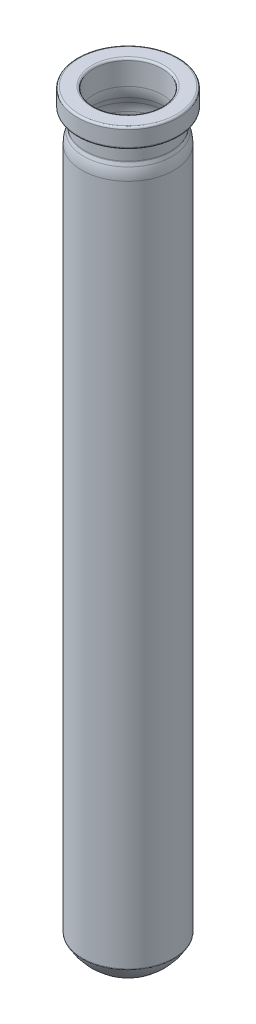
ISO-10303-21;
HEADER;
FILE_DESCRIPTION(('STEP AP214'),'2;1');
FILE_NAME('part.step','',(''),(''),'','','');
FILE_SCHEMA(('AUTOMOTIVE_DESIGN { 1 0 10303 214 1 1 1 1 }'));
ENDSEC;
DATA;
#1=APPLICATION_CONTEXT('core data for automotive mechanical design processes');
#2=APPLICATION_PROTOCOL_DEFINITION('international standard','automotive_design',2000,#1);
#3=PRODUCT_CONTEXT('',#1,'mechanical');
#4=PRODUCT('Part','Part','',(#3));
#5=PRODUCT_RELATED_PRODUCT_CATEGORY('part','',(#4));
#6=PRODUCT_DEFINITION_FORMATION('','',#4);
#7=PRODUCT_DEFINITION_CONTEXT('part definition',#1,'design');
#8=PRODUCT_DEFINITION('design','',#6,#7);
#9=PRODUCT_DEFINITION_SHAPE('','',#8);
#10=(LENGTH_UNIT() NAMED_UNIT(*) SI_UNIT(.MILLI.,.METRE.));
#11=(NAMED_UNIT(*) PLANE_ANGLE_UNIT() SI_UNIT($,.RADIAN.));
#12=(NAMED_UNIT(*) SI_UNIT($,.STERADIAN.) SOLID_ANGLE_UNIT());
#13=UNCERTAINTY_MEASURE_WITH_UNIT(LENGTH_MEASURE(1.E-05),#10,'distance_accuracy_value','');
#14=(GEOMETRIC_REPRESENTATION_CONTEXT(3) GLOBAL_UNCERTAINTY_ASSIGNED_CONTEXT((#13)) GLOBAL_UNIT_ASSIGNED_CONTEXT((#10,
#11,#12)) REPRESENTATION_CONTEXT('',''));
#15=CARTESIAN_POINT('',(0.,0.,0.));
#16=DIRECTION('',(0.,0.,1.));
#17=DIRECTION('',(1.,0.,0.));
#18=AXIS2_PLACEMENT_3D('',#15,#16,#17);
#19=CARTESIAN_POINT('',(0.,10.089599086758,0.));
#20=DIRECTION('',(0.,-1.,0.));
#21=DIRECTION('',(-1.,0.,0.));
#22=AXIS2_PLACEMENT_3D('',#19,#20,#21);
#23=SPHERICAL_SURFACE('',#22,10.089599086758);
#24=CARTESIAN_POINT('',(0.,5.47971329316192,0.));
#25=DIRECTION('',(0.,-1.,0.));
#26=DIRECTION('',(0.,0.,-1.));
#27=AXIS2_PLACEMENT_3D('',#24,#25,#26);
#28=CIRCLE('',#27,8.97490739236393);
#29=CARTESIAN_POINT('',(0.,5.47971329316192,-8.97490739236393));
#30=VERTEX_POINT('',#29);
#31=EDGE_CURVE('E101',#30,#30,#28,.T.);
#32=ORIENTED_EDGE('',*,*,#31,.T.);
#33=EDGE_LOOP('',(#32));
#34=FACE_BOUND('',#33,.T.);
#35=ADVANCED_FACE('F37',(#34),#23,.T.);
#36=CARTESIAN_POINT('',(0.,10.089599086758,0.));
#37=DIRECTION('',(0.,-1.,0.));
#38=DIRECTION('',(-1.,0.,0.));
#39=AXIS2_PLACEMENT_3D('',#36,#37,#38);
#40=SPHERICAL_SURFACE('',#39,8.56559908675799);
#41=CARTESIAN_POINT('',(0.,3.60575627135558,0.));
#42=DIRECTION('',(0.,-1.,0.));
#43=DIRECTION('',(0.,0.,-1.));
#44=AXIS2_PLACEMENT_3D('',#41,#42,#43);
#45=CIRCLE('',#44,5.59725558289274);
#46=CARTESIAN_POINT('',(0.,3.60575627135558,-5.59725558289274));
#47=VERTEX_POINT('',#46);
#48=EDGE_CURVE('E10',#47,#47,#45,.T.);
#49=ORIENTED_EDGE('',*,*,#48,.F.);
#50=EDGE_LOOP('',(#49));
#51=FACE_BOUND('',#50,.T.);
#52=ADVANCED_FACE('F215',(#51),#40,.F.);
#53=CARTESIAN_POINT('',(0.,8.41247223608663,0.));
#54=DIRECTION('',(0.,-1.,0.));
#55=DIRECTION('',(0.,0.,-1.));
#56=AXIS2_PLACEMENT_3D('',#53,#54,#55);
#57=DEGENERATE_TOROIDAL_SURFACE('',#56,1.4478,6.35,.T.);
#58=CARTESIAN_POINT('',(0.,8.41247223608663,0.));
#59=DIRECTION('',(0.,-1.,0.));
#60=DIRECTION('',(0.,0.,-1.));
#61=AXIS2_PLACEMENT_3D('',#58,#59,#60);
#62=CIRCLE('',#61,7.7978);
#63=CARTESIAN_POINT('',(0.,8.41247223608663,-7.7978));
#64=VERTEX_POINT('',#63);
#65=EDGE_CURVE('E43',#64,#64,#62,.T.);
#66=ORIENTED_EDGE('',*,*,#65,.F.);
#67=EDGE_LOOP('',(#66));
#68=FACE_BOUND('',#67,.T.);
#69=ORIENTED_EDGE('',*,*,#48,.T.);
#70=EDGE_LOOP('',(#69));
#71=FACE_BOUND('',#70,.T.);
#72=ADVANCED_FACE('F210',(#68,#71),#57,.F.);
#73=CARTESIAN_POINT('',(0.,-45.5602517932161,0.));
#74=DIRECTION('',(0.,-1.,0.));
#75=DIRECTION('',(0.,0.,-1.));
#76=AXIS2_PLACEMENT_3D('',#73,#74,#75);
#77=CYLINDRICAL_SURFACE('',#76,7.7978);
#78=CARTESIAN_POINT('',(0.,139.49318254792,0.));
#79=DIRECTION('',(0.,-1.,0.));
#80=DIRECTION('',(0.,0.,-1.));
#81=AXIS2_PLACEMENT_3D('',#78,#79,#80);
#82=CIRCLE('',#81,7.7978);
#83=CARTESIAN_POINT('',(0.,139.49318254792,-7.7978));
#84=VERTEX_POINT('',#83);
#85=EDGE_CURVE('E47',#84,#84,#82,.T.);
#86=ORIENTED_EDGE('',*,*,#85,.F.);
#87=EDGE_LOOP('',(#86));
#88=FACE_BOUND('',#87,.T.);
#89=ORIENTED_EDGE('',*,*,#65,.T.);
#90=EDGE_LOOP('',(#89));
#91=FACE_BOUND('',#90,.T.);
#92=ADVANCED_FACE('F205',(#88,#91),#77,.F.);
#93=CARTESIAN_POINT('',(0.,139.49318254792,0.));
#94=DIRECTION('',(0.,-1.,0.));
#95=DIRECTION('',(0.,0.,-1.));
#96=AXIS2_PLACEMENT_3D('',#93,#94,#95);
#97=DEGENERATE_TOROIDAL_SURFACE('',#96,2.667,5.1308,.T.);
#98=CARTESIAN_POINT('',(0.,141.248019499296,0.));
#99=DIRECTION('',(0.,-1.,0.));
#100=DIRECTION('',(0.,0.,-1.));
#101=AXIS2_PLACEMENT_3D('',#98,#99,#100);
#102=CIRCLE('',#101,7.48837489872833);
#103=CARTESIAN_POINT('',(0.,141.248019499296,-7.48837489872833));
#104=VERTEX_POINT('',#103);
#105=EDGE_CURVE('E51',#104,#104,#102,.T.);
#106=ORIENTED_EDGE('',*,*,#105,.F.);
#107=EDGE_LOOP('',(#106));
#108=FACE_BOUND('',#107,.T.);
#109=ORIENTED_EDGE('',*,*,#85,.T.);
#110=EDGE_LOOP('',(#109));
#111=FACE_BOUND('',#110,.T.);
#112=ADVANCED_FACE('F199',(#108,#111),#97,.F.);
#113=CARTESIAN_POINT('',(0.,141.248019499296,0.));
#114=DIRECTION('',(0.,-1.,0.));
#115=DIRECTION('',(0.,0.,-1.));
#116=AXIS2_PLACEMENT_3D('',#113,#114,#115);
#117=CONICAL_SURFACE('',#116,7.48837489872833,0.349065850398861);
#118=CARTESIAN_POINT('',(0.,142.346524275449,0.));
#119=DIRECTION('',(0.,-1.,0.));
#120=DIRECTION('',(0.,0.,-1.));
#121=AXIS2_PLACEMENT_3D('',#118,#119,#120);
#122=CIRCLE('',#121,7.08855185800948);
#123=CARTESIAN_POINT('',(0.,142.346524275449,-7.08855185800948));
#124=VERTEX_POINT('',#123);
#125=EDGE_CURVE('E56',#124,#124,#122,.T.);
#126=ORIENTED_EDGE('',*,*,#125,.F.);
#127=EDGE_LOOP('',(#126));
#128=FACE_BOUND('',#127,.T.);
#129=ORIENTED_EDGE('',*,*,#105,.T.);
#130=EDGE_LOOP('',(#129));
#131=FACE_BOUND('',#130,.T.);
#132=ADVANCED_FACE('F193',(#128,#131),#117,.F.);
#133=CARTESIAN_POINT('',(0.,144.518352185567,0.));
#134=DIRECTION('',(0.,-1.,0.));
#135=DIRECTION('',(0.,0.,-1.));
#136=AXIS2_PLACEMENT_3D('',#133,#134,#135);
#137=TOROIDAL_SURFACE('',#136,13.0556,6.35);
#138=CARTESIAN_POINT('',(0.,144.518352185567,0.));
#139=DIRECTION('',(0.,-1.,0.));
#140=DIRECTION('',(0.,0.,-1.));
#141=AXIS2_PLACEMENT_3D('',#138,#139,#140);
#142=CIRCLE('',#141,6.7056);
#143=CARTESIAN_POINT('',(0.,144.518352185567,-6.7056));
#144=VERTEX_POINT('',#143);
#145=EDGE_CURVE('E59',#144,#144,#142,.T.);
#146=ORIENTED_EDGE('',*,*,#145,.F.);
#147=EDGE_LOOP('',(#146));
#148=FACE_BOUND('',#147,.T.);
#149=ORIENTED_EDGE('',*,*,#125,.T.);
#150=EDGE_LOOP('',(#149));
#151=FACE_BOUND('',#150,.T.);
#152=ADVANCED_FACE('F187',(#148,#151),#137,.T.);
#153=CARTESIAN_POINT('',(0.,-45.5602517932161,0.));
#154=DIRECTION('',(0.,-1.,0.));
#155=DIRECTION('',(0.,0.,-1.));
#156=AXIS2_PLACEMENT_3D('',#153,#154,#155);
#157=CYLINDRICAL_SURFACE('',#156,6.7056);
#158=CARTESIAN_POINT('',(0.,148.9202,0.));
#159=DIRECTION('',(0.,-1.,0.));
#160=DIRECTION('',(0.,0.,-1.));
#161=AXIS2_PLACEMENT_3D('',#158,#159,#160);
#162=CIRCLE('',#161,6.7056);
#163=CARTESIAN_POINT('',(0.,148.9202,-6.7056));
#164=VERTEX_POINT('',#163);
#165=EDGE_CURVE('E62',#164,#164,#162,.T.);
#166=ORIENTED_EDGE('',*,*,#165,.F.);
#167=EDGE_LOOP('',(#166));
#168=FACE_BOUND('',#167,.T.);
#169=ORIENTED_EDGE('',*,*,#145,.T.);
#170=EDGE_LOOP('',(#169));
#171=FACE_BOUND('',#170,.T.);
#172=ADVANCED_FACE('F181',(#168,#171),#157,.F.);
#173=CARTESIAN_POINT('',(0.,148.9202,0.));
#174=DIRECTION('',(0.,-1.,0.));
#175=DIRECTION('',(0.,0.,-1.));
#176=AXIS2_PLACEMENT_3D('',#173,#174,#175);
#177=TOROIDAL_SURFACE('',#176,7.0866,0.380999999999996);
#178=CARTESIAN_POINT('',(0.,149.3012,0.));
#179=DIRECTION('',(0.,-1.,0.));
#180=DIRECTION('',(0.,0.,-1.));
#181=AXIS2_PLACEMENT_3D('',#178,#179,#180);
#182=CIRCLE('',#181,7.0866);
#183=CARTESIAN_POINT('',(0.,149.3012,-7.0866));
#184=VERTEX_POINT('',#183);
#185=EDGE_CURVE('E65',#184,#184,#182,.T.);
#186=ORIENTED_EDGE('',*,*,#185,.F.);
#187=EDGE_LOOP('',(#186));
#188=FACE_BOUND('',#187,.T.);
#189=ORIENTED_EDGE('',*,*,#165,.T.);
#190=EDGE_LOOP('',(#189));
#191=FACE_BOUND('',#190,.T.);
#192=ADVANCED_FACE('F175',(#188,#191),#177,.T.);
#193=CARTESIAN_POINT('',(-9.5377,149.3012,0.));
#194=DIRECTION('',(0.,-1.,0.));
#195=DIRECTION('',(0.,0.,-1.));
#196=AXIS2_PLACEMENT_3D('',#193,#194,#195);
#197=PLANE('',#196);
#198=CARTESIAN_POINT('',(0.,149.3012,0.));
#199=DIRECTION('',(0.,-1.,0.));
#200=DIRECTION('',(0.,0.,-1.));
#201=AXIS2_PLACEMENT_3D('',#198,#199,#200);
#202=CIRCLE('',#201,9.5377);
#203=CARTESIAN_POINT('',(0.,149.3012,-9.5377));
#204=VERTEX_POINT('',#203);
#205=EDGE_CURVE('E68',#204,#204,#202,.T.);
#206=ORIENTED_EDGE('',*,*,#205,.F.);
#207=EDGE_LOOP('',(#206));
#208=FACE_BOUND('',#207,.T.);
#209=ORIENTED_EDGE('',*,*,#185,.T.);
#210=EDGE_LOOP('',(#209));
#211=FACE_BOUND('',#210,.T.);
#212=ADVANCED_FACE('F169',(#208,#211),#197,.F.);
#213=CARTESIAN_POINT('',(0.,148.9202,0.));
#214=DIRECTION('',(0.,-1.,0.));
#215=DIRECTION('',(0.,0.,-1.));
#216=AXIS2_PLACEMENT_3D('',#213,#214,#215);
#217=TOROIDAL_SURFACE('',#216,9.5377,0.380999999999996);
#218=CARTESIAN_POINT('',(0.,148.9202,0.));
#219=DIRECTION('',(0.,-1.,0.));
#220=DIRECTION('',(0.,0.,-1.));
#221=AXIS2_PLACEMENT_3D('',#218,#219,#220);
#222=CIRCLE('',#221,9.9187);
#223=CARTESIAN_POINT('',(0.,148.9202,-9.9187));
#224=VERTEX_POINT('',#223);
#225=EDGE_CURVE('E71',#224,#224,#222,.T.);
#226=ORIENTED_EDGE('',*,*,#225,.F.);
#227=EDGE_LOOP('',(#226));
#228=FACE_BOUND('',#227,.T.);
#229=ORIENTED_EDGE('',*,*,#205,.T.);
#230=EDGE_LOOP('',(#229));
#231=FACE_BOUND('',#230,.T.);
#232=ADVANCED_FACE('F163',(#228,#231),#217,.T.);
#233=CARTESIAN_POINT('',(0.,-45.5602517932161,0.));
#234=DIRECTION('',(0.,-1.,0.));
#235=DIRECTION('',(0.,0.,-1.));
#236=AXIS2_PLACEMENT_3D('',#233,#234,#235);
#237=CYLINDRICAL_SURFACE('',#236,9.9187);
#238=CARTESIAN_POINT('',(0.,145.8976,0.));
#239=DIRECTION('',(0.,-1.,0.));
#240=DIRECTION('',(0.,0.,-1.));
#241=AXIS2_PLACEMENT_3D('',#238,#239,#240);
#242=CIRCLE('',#241,9.9187);
#243=CARTESIAN_POINT('',(0.,145.8976,-9.9187));
#244=VERTEX_POINT('',#243);
#245=EDGE_CURVE('E74',#244,#244,#242,.T.);
#246=ORIENTED_EDGE('',*,*,#245,.F.);
#247=EDGE_LOOP('',(#246));
#248=FACE_BOUND('',#247,.T.);
#249=ORIENTED_EDGE('',*,*,#225,.T.);
#250=EDGE_LOOP('',(#249));
#251=FACE_BOUND('',#250,.T.);
#252=ADVANCED_FACE('F157',(#248,#251),#237,.T.);
#253=CARTESIAN_POINT('',(0.,145.8976,0.));
#254=DIRECTION('',(0.,-1.,0.));
#255=DIRECTION('',(0.,0.,-1.));
#256=AXIS2_PLACEMENT_3D('',#253,#254,#255);
#257=TOROIDAL_SURFACE('',#256,9.5377,0.380999999999996);
#258=CARTESIAN_POINT('',(0.,145.5166,0.));
#259=DIRECTION('',(0.,-1.,0.));
#260=DIRECTION('',(0.,0.,-1.));
#261=AXIS2_PLACEMENT_3D('',#258,#259,#260);
#262=CIRCLE('',#261,9.5377);
#263=CARTESIAN_POINT('',(0.,145.5166,-9.5377));
#264=VERTEX_POINT('',#263);
#265=EDGE_CURVE('E77',#264,#264,#262,.T.);
#266=ORIENTED_EDGE('',*,*,#265,.F.);
#267=EDGE_LOOP('',(#266));
#268=FACE_BOUND('',#267,.T.);
#269=ORIENTED_EDGE('',*,*,#245,.T.);
#270=EDGE_LOOP('',(#269));
#271=FACE_BOUND('',#270,.T.);
#272=ADVANCED_FACE('F151',(#268,#271),#257,.T.);
#273=CARTESIAN_POINT('',(-9.5377,145.5166,0.));
#274=DIRECTION('',(0.,1.,0.));
#275=DIRECTION('',(0.,0.,1.));
#276=AXIS2_PLACEMENT_3D('',#273,#274,#275);
#277=PLANE('',#276);
#278=CARTESIAN_POINT('',(0.,145.5166,0.));
#279=DIRECTION('',(0.,-1.,0.));
#280=DIRECTION('',(0.,0.,-1.));
#281=AXIS2_PLACEMENT_3D('',#278,#279,#280);
#282=CIRCLE('',#281,8.7503);
#283=CARTESIAN_POINT('',(0.,145.5166,-8.7503));
#284=VERTEX_POINT('',#283);
#285=EDGE_CURVE('E80',#284,#284,#282,.T.);
#286=ORIENTED_EDGE('',*,*,#285,.F.);
#287=EDGE_LOOP('',(#286));
#288=FACE_BOUND('',#287,.T.);
#289=ORIENTED_EDGE('',*,*,#265,.T.);
#290=EDGE_LOOP('',(#289));
#291=FACE_BOUND('',#290,.T.);
#292=ADVANCED_FACE('F145',(#288,#291),#277,.F.);
#293=CARTESIAN_POINT('',(0.,145.1356,0.));
#294=DIRECTION('',(0.,-1.,0.));
#295=DIRECTION('',(0.,0.,-1.));
#296=AXIS2_PLACEMENT_3D('',#293,#294,#295);
#297=TOROIDAL_SURFACE('',#296,8.7503,0.380999999999996);
#298=CARTESIAN_POINT('',(0.,145.1356,0.));
#299=DIRECTION('',(0.,-1.,0.));
#300=DIRECTION('',(0.,0.,-1.));
#301=AXIS2_PLACEMENT_3D('',#298,#299,#300);
#302=CIRCLE('',#301,8.3693);
#303=CARTESIAN_POINT('',(0.,145.1356,-8.3693));
#304=VERTEX_POINT('',#303);
#305=EDGE_CURVE('E83',#304,#304,#302,.T.);
#306=ORIENTED_EDGE('',*,*,#305,.F.);
#307=EDGE_LOOP('',(#306));
#308=FACE_BOUND('',#307,.T.);
#309=ORIENTED_EDGE('',*,*,#285,.T.);
#310=EDGE_LOOP('',(#309));
#311=FACE_BOUND('',#310,.T.);
#312=ADVANCED_FACE('F139',(#308,#311),#297,.F.);
#313=CARTESIAN_POINT('',(0.,-45.5602517932161,0.));
#314=DIRECTION('',(0.,-1.,0.));
#315=DIRECTION('',(0.,0.,-1.));
#316=AXIS2_PLACEMENT_3D('',#313,#314,#315);
#317=CYLINDRICAL_SURFACE('',#316,8.3693);
#318=CARTESIAN_POINT('',(0.,142.45958057965,0.));
#319=DIRECTION('',(0.,-1.,0.));
#320=DIRECTION('',(0.,0.,-1.));
#321=AXIS2_PLACEMENT_3D('',#318,#319,#320);
#322=CIRCLE('',#321,8.3693);
#323=CARTESIAN_POINT('',(0.,142.45958057965,-8.3693));
#324=VERTEX_POINT('',#323);
#325=EDGE_CURVE('E86',#324,#324,#322,.T.);
#326=ORIENTED_EDGE('',*,*,#325,.F.);
#327=EDGE_LOOP('',(#326));
#328=FACE_BOUND('',#327,.T.);
#329=ORIENTED_EDGE('',*,*,#305,.T.);
#330=EDGE_LOOP('',(#329));
#331=FACE_BOUND('',#330,.T.);
#332=ADVANCED_FACE('F133',(#328,#331),#317,.T.);
#333=CARTESIAN_POINT('',(0.,142.45958057965,0.));
#334=DIRECTION('',(0.,-1.,0.));
#335=DIRECTION('',(0.,0.,-1.));
#336=AXIS2_PLACEMENT_3D('',#333,#334,#335);
#337=TOROIDAL_SURFACE('',#336,8.7503,0.380999999999996);
#338=CARTESIAN_POINT('',(0.,142.329270905043,0.));
#339=DIRECTION('',(0.,-1.,0.));
#340=DIRECTION('',(0.,0.,-1.));
#341=AXIS2_PLACEMENT_3D('',#338,#339,#340);
#342=CIRCLE('',#341,8.39227711148057);
#343=CARTESIAN_POINT('',(0.,142.329270905043,-8.39227711148057));
#344=VERTEX_POINT('',#343);
#345=EDGE_CURVE('E89',#344,#344,#342,.T.);
#346=ORIENTED_EDGE('',*,*,#345,.F.);
#347=EDGE_LOOP('',(#346));
#348=FACE_BOUND('',#347,.T.);
#349=ORIENTED_EDGE('',*,*,#325,.T.);
#350=EDGE_LOOP('',(#349));
#351=FACE_BOUND('',#350,.T.);
#352=ADVANCED_FACE('F127',(#348,#351),#337,.F.);
#353=CARTESIAN_POINT('',(0.,142.329270905043,0.));
#354=DIRECTION('',(0.,-1.,0.));
#355=DIRECTION('',(0.,0.,-1.));
#356=AXIS2_PLACEMENT_3D('',#353,#354,#355);
#357=CONICAL_SURFACE('',#356,8.39227711148057,0.349065850398865);
#358=CARTESIAN_POINT('',(0.,141.665010458038,0.));
#359=DIRECTION('',(0.,-1.,0.));
#360=DIRECTION('',(0.,0.,-1.));
#361=AXIS2_PLACEMENT_3D('',#358,#359,#360);
#362=CIRCLE('',#361,8.63404814199051);
#363=CARTESIAN_POINT('',(0.,141.665010458038,-8.63404814199051));
#364=VERTEX_POINT('',#363);
#365=EDGE_CURVE('E92',#364,#364,#362,.T.);
#366=ORIENTED_EDGE('',*,*,#365,.F.);
#367=EDGE_LOOP('',(#366));
#368=FACE_BOUND('',#367,.T.);
#369=ORIENTED_EDGE('',*,*,#345,.T.);
#370=EDGE_LOOP('',(#369));
#371=FACE_BOUND('',#370,.T.);
#372=ADVANCED_FACE('F121',(#368,#371),#357,.T.);
#373=CARTESIAN_POINT('',(0.,139.49318254792,0.));
#374=DIRECTION('',(0.,-1.,0.));
#375=DIRECTION('',(0.,0.,-1.));
#376=AXIS2_PLACEMENT_3D('',#373,#374,#375);
#377=DEGENERATE_TOROIDAL_SURFACE('',#376,2.667,6.35,.T.);
#378=CARTESIAN_POINT('',(0.,139.49318254792,0.));
#379=DIRECTION('',(0.,-1.,0.));
#380=DIRECTION('',(0.,0.,-1.));
#381=AXIS2_PLACEMENT_3D('',#378,#379,#380);
#382=CIRCLE('',#381,9.017);
#383=CARTESIAN_POINT('',(0.,139.49318254792,-9.017));
#384=VERTEX_POINT('',#383);
#385=EDGE_CURVE('E95',#384,#384,#382,.T.);
#386=ORIENTED_EDGE('',*,*,#385,.F.);
#387=EDGE_LOOP('',(#386));
#388=FACE_BOUND('',#387,.T.);
#389=ORIENTED_EDGE('',*,*,#365,.T.);
#390=EDGE_LOOP('',(#389));
#391=FACE_BOUND('',#390,.T.);
#392=ADVANCED_FACE('F115',(#388,#391),#377,.T.);
#393=CARTESIAN_POINT('',(0.,-45.5602517932161,0.));
#394=DIRECTION('',(0.,-1.,0.));
#395=DIRECTION('',(0.,0.,-1.));
#396=AXIS2_PLACEMENT_3D('',#393,#394,#395);
#397=CYLINDRICAL_SURFACE('',#396,9.017);
#398=CARTESIAN_POINT('',(0.,5.65379022845514,0.));
#399=DIRECTION('',(0.,-1.,0.));
#400=DIRECTION('',(0.,0.,-1.));
#401=AXIS2_PLACEMENT_3D('',#398,#399,#400);
#402=CIRCLE('',#401,9.017);
#403=CARTESIAN_POINT('',(0.,5.65379022845514,-9.017));
#404=VERTEX_POINT('',#403);
#405=EDGE_CURVE('E98',#404,#404,#402,.T.);
#406=ORIENTED_EDGE('',*,*,#405,.F.);
#407=EDGE_LOOP('',(#406));
#408=FACE_BOUND('',#407,.T.);
#409=ORIENTED_EDGE('',*,*,#385,.T.);
#410=EDGE_LOOP('',(#409));
#411=FACE_BOUND('',#410,.T.);
#412=ADVANCED_FACE('F109',(#408,#411),#397,.T.);
#413=CARTESIAN_POINT('',(0.,5.65379022845513,0.));
#414=DIRECTION('',(0.,-1.,0.));
#415=DIRECTION('',(0.,0.,-1.));
#416=AXIS2_PLACEMENT_3D('',#413,#414,#415);
#417=TOROIDAL_SURFACE('',#416,8.636,0.381);
#418=ORIENTED_EDGE('',*,*,#31,.F.);
#419=EDGE_LOOP('',(#418));
#420=FACE_BOUND('',#419,.T.);
#421=ORIENTED_EDGE('',*,*,#405,.T.);
#422=EDGE_LOOP('',(#421));
#423=FACE_BOUND('',#422,.T.);
#424=ADVANCED_FACE('F106',(#420,#423),#417,.T.);
#425=CLOSED_SHELL('',(#35,#52,#72,#92,#112,#132,#152,#172,#192,#212,#232,#252,#272,#292,#312,
#332,#352,#372,#392,#412,#424));
#426=MANIFOLD_SOLID_BREP('B2',#425);
#427=ADVANCED_BREP_SHAPE_REPRESENTATION('',(#18,#426),#14);
#428=SHAPE_DEFINITION_REPRESENTATION(#9,#427);
ENDSEC;
END-ISO-10303-21;
